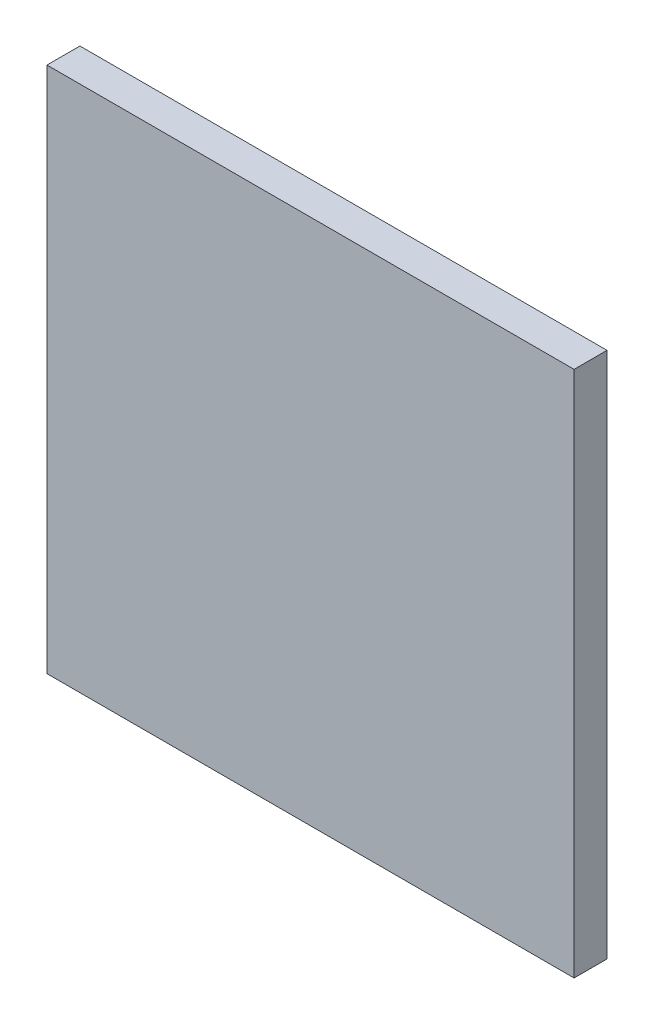
ISO-10303-21;
HEADER;
FILE_DESCRIPTION(('STEP AP214'),'2;1');
FILE_NAME('part.step','',(''),(''),'','','');
FILE_SCHEMA(('AUTOMOTIVE_DESIGN { 1 0 10303 214 1 1 1 1 }'));
ENDSEC;
DATA;
#1=APPLICATION_CONTEXT('core data for automotive mechanical design processes');
#2=APPLICATION_PROTOCOL_DEFINITION('international standard','automotive_design',2000,#1);
#3=PRODUCT_CONTEXT('',#1,'mechanical');
#4=PRODUCT('Part','Part','',(#3));
#5=PRODUCT_RELATED_PRODUCT_CATEGORY('part','',(#4));
#6=PRODUCT_DEFINITION_FORMATION('','',#4);
#7=PRODUCT_DEFINITION_CONTEXT('part definition',#1,'design');
#8=PRODUCT_DEFINITION('design','',#6,#7);
#9=PRODUCT_DEFINITION_SHAPE('','',#8);
#10=(LENGTH_UNIT() NAMED_UNIT(*) SI_UNIT(.MILLI.,.METRE.));
#11=(NAMED_UNIT(*) PLANE_ANGLE_UNIT() SI_UNIT($,.RADIAN.));
#12=(NAMED_UNIT(*) SI_UNIT($,.STERADIAN.) SOLID_ANGLE_UNIT());
#13=UNCERTAINTY_MEASURE_WITH_UNIT(LENGTH_MEASURE(1.E-05),#10,'distance_accuracy_value','');
#14=(GEOMETRIC_REPRESENTATION_CONTEXT(3) GLOBAL_UNCERTAINTY_ASSIGNED_CONTEXT((#13)) GLOBAL_UNIT_ASSIGNED_CONTEXT((#10,
#11,#12)) REPRESENTATION_CONTEXT('',''));
#15=CARTESIAN_POINT('',(0.,0.,0.));
#16=DIRECTION('',(0.,0.,1.));
#17=DIRECTION('',(1.,0.,0.));
#18=AXIS2_PLACEMENT_3D('',#15,#16,#17);
#19=CARTESIAN_POINT('',(0.,0.,6.35));
#20=DIRECTION('',(1.,0.,0.));
#21=DIRECTION('',(0.,1.,0.));
#22=AXIS2_PLACEMENT_3D('',#19,#20,#21);
#23=PLANE('',#22);
#24=DIRECTION('',(0.,-1.,0.));
#25=VECTOR('',#24,1.);
#26=CARTESIAN_POINT('',(0.,0.,0.));
#27=LINE('',#26,#25);
#28=CARTESIAN_POINT('',(0.,101.6,0.));
#29=VERTEX_POINT('',#28);
#30=CARTESIAN_POINT('',(0.,0.,0.));
#31=VERTEX_POINT('',#30);
#32=EDGE_CURVE('E94',#29,#31,#27,.T.);
#33=ORIENTED_EDGE('',*,*,#32,.T.);
#34=DIRECTION('',(0.,0.,-1.));
#35=VECTOR('',#34,1.);
#36=CARTESIAN_POINT('',(0.,0.,6.35));
#37=LINE('',#36,#35);
#38=CARTESIAN_POINT('',(0.,0.,6.35));
#39=VERTEX_POINT('',#38);
#40=EDGE_CURVE('E11',#39,#31,#37,.T.);
#41=ORIENTED_EDGE('',*,*,#40,.F.);
#42=DIRECTION('',(0.,-1.,0.));
#43=VECTOR('',#42,1.);
#44=CARTESIAN_POINT('',(0.,0.,6.35));
#45=LINE('',#44,#43);
#46=CARTESIAN_POINT('',(0.,101.6,6.35));
#47=VERTEX_POINT('',#46);
#48=EDGE_CURVE('E82',#47,#39,#45,.T.);
#49=ORIENTED_EDGE('',*,*,#48,.F.);
#50=DIRECTION('',(0.,0.,-1.));
#51=VECTOR('',#50,1.);
#52=CARTESIAN_POINT('',(0.,101.6,6.35));
#53=LINE('',#52,#51);
#54=EDGE_CURVE('E90',#47,#29,#53,.T.);
#55=ORIENTED_EDGE('',*,*,#54,.T.);
#56=EDGE_LOOP('',(#33,#41,#49,#55));
#57=FACE_BOUND('',#56,.T.);
#58=ADVANCED_FACE('F31',(#57),#23,.F.);
#59=CARTESIAN_POINT('',(0.,0.,6.35));
#60=DIRECTION('',(0.,1.,0.));
#61=DIRECTION('',(0.,0.,1.));
#62=AXIS2_PLACEMENT_3D('',#59,#60,#61);
#63=PLANE('',#62);
#64=DIRECTION('',(1.,0.,0.));
#65=VECTOR('',#64,1.);
#66=CARTESIAN_POINT('',(0.,0.,0.));
#67=LINE('',#66,#65);
#68=CARTESIAN_POINT('',(101.6,0.,0.));
#69=VERTEX_POINT('',#68);
#70=EDGE_CURVE('E86',#31,#69,#67,.T.);
#71=ORIENTED_EDGE('',*,*,#70,.T.);
#72=DIRECTION('',(0.,0.,-1.));
#73=VECTOR('',#72,1.);
#74=CARTESIAN_POINT('',(101.6,0.,6.35));
#75=LINE('',#74,#73);
#76=CARTESIAN_POINT('',(101.6,0.,6.35));
#77=VERTEX_POINT('',#76);
#78=EDGE_CURVE('E39',#77,#69,#75,.T.);
#79=ORIENTED_EDGE('',*,*,#78,.F.);
#80=DIRECTION('',(1.,0.,0.));
#81=VECTOR('',#80,1.);
#82=CARTESIAN_POINT('',(0.,0.,6.35));
#83=LINE('',#82,#81);
#84=EDGE_CURVE('E77',#39,#77,#83,.T.);
#85=ORIENTED_EDGE('',*,*,#84,.F.);
#86=ORIENTED_EDGE('',*,*,#40,.T.);
#87=EDGE_LOOP('',(#71,#79,#85,#86));
#88=FACE_BOUND('',#87,.T.);
#89=ADVANCED_FACE('F85',(#88),#63,.F.);
#90=CARTESIAN_POINT('',(101.6,0.,6.35));
#91=DIRECTION('',(-1.,0.,0.));
#92=DIRECTION('',(0.,-1.,0.));
#93=AXIS2_PLACEMENT_3D('',#90,#91,#92);
#94=PLANE('',#93);
#95=DIRECTION('',(0.,1.,0.));
#96=VECTOR('',#95,1.);
#97=CARTESIAN_POINT('',(101.6,0.,0.));
#98=LINE('',#97,#96);
#99=CARTESIAN_POINT('',(101.6,101.6,0.));
#100=VERTEX_POINT('',#99);
#101=EDGE_CURVE('E64',#69,#100,#98,.T.);
#102=ORIENTED_EDGE('',*,*,#101,.T.);
#103=DIRECTION('',(0.,0.,-1.));
#104=VECTOR('',#103,1.);
#105=CARTESIAN_POINT('',(101.6,101.6,6.35));
#106=LINE('',#105,#104);
#107=CARTESIAN_POINT('',(101.6,101.6,6.35));
#108=VERTEX_POINT('',#107);
#109=EDGE_CURVE('E87',#108,#100,#106,.T.);
#110=ORIENTED_EDGE('',*,*,#109,.F.);
#111=DIRECTION('',(0.,1.,0.));
#112=VECTOR('',#111,1.);
#113=CARTESIAN_POINT('',(101.6,0.,6.35));
#114=LINE('',#113,#112);
#115=EDGE_CURVE('E80',#77,#108,#114,.T.);
#116=ORIENTED_EDGE('',*,*,#115,.F.);
#117=ORIENTED_EDGE('',*,*,#78,.T.);
#118=EDGE_LOOP('',(#102,#110,#116,#117));
#119=FACE_BOUND('',#118,.T.);
#120=ADVANCED_FACE('F88',(#119),#94,.F.);
#121=CARTESIAN_POINT('',(0.,101.6,6.35));
#122=DIRECTION('',(0.,-1.,0.));
#123=DIRECTION('',(0.,0.,-1.));
#124=AXIS2_PLACEMENT_3D('',#121,#122,#123);
#125=PLANE('',#124);
#126=DIRECTION('',(-1.,0.,0.));
#127=VECTOR('',#126,1.);
#128=CARTESIAN_POINT('',(0.,101.6,0.));
#129=LINE('',#128,#127);
#130=EDGE_CURVE('E70',#100,#29,#129,.T.);
#131=ORIENTED_EDGE('',*,*,#130,.T.);
#132=ORIENTED_EDGE('',*,*,#54,.F.);
#133=DIRECTION('',(-1.,0.,0.));
#134=VECTOR('',#133,1.);
#135=CARTESIAN_POINT('',(0.,101.6,6.35));
#136=LINE('',#135,#134);
#137=EDGE_CURVE('E47',#108,#47,#136,.T.);
#138=ORIENTED_EDGE('',*,*,#137,.F.);
#139=ORIENTED_EDGE('',*,*,#109,.T.);
#140=EDGE_LOOP('',(#131,#132,#138,#139));
#141=FACE_BOUND('',#140,.T.);
#142=ADVANCED_FACE('F101',(#141),#125,.F.);
#143=CARTESIAN_POINT('',(0.,101.6,6.35));
#144=DIRECTION('',(0.,0.,-1.));
#145=DIRECTION('',(-1.,0.,0.));
#146=AXIS2_PLACEMENT_3D('',#143,#144,#145);
#147=PLANE('',#146);
#148=ORIENTED_EDGE('',*,*,#48,.T.);
#149=ORIENTED_EDGE('',*,*,#84,.T.);
#150=ORIENTED_EDGE('',*,*,#115,.T.);
#151=ORIENTED_EDGE('',*,*,#137,.T.);
#152=EDGE_LOOP('',(#148,#149,#150,#151));
#153=FACE_BOUND('',#152,.T.);
#154=ADVANCED_FACE('F78',(#153),#147,.F.);
#155=CARTESIAN_POINT('',(0.,101.6,0.));
#156=DIRECTION('',(0.,0.,-1.));
#157=DIRECTION('',(-1.,0.,0.));
#158=AXIS2_PLACEMENT_3D('',#155,#156,#157);
#159=PLANE('',#158);
#160=ORIENTED_EDGE('',*,*,#32,.F.);
#161=ORIENTED_EDGE('',*,*,#130,.F.);
#162=ORIENTED_EDGE('',*,*,#101,.F.);
#163=ORIENTED_EDGE('',*,*,#70,.F.);
#164=EDGE_LOOP('',(#160,#161,#162,#163));
#165=FACE_BOUND('',#164,.T.);
#166=ADVANCED_FACE('F104',(#165),#159,.T.);
#167=CLOSED_SHELL('',(#58,#89,#120,#142,#154,#166));
#168=MANIFOLD_SOLID_BREP('B2',#167);
#169=ADVANCED_BREP_SHAPE_REPRESENTATION('',(#18,#168),#14);
#170=SHAPE_DEFINITION_REPRESENTATION(#9,#169);
ENDSEC;
END-ISO-10303-21;
